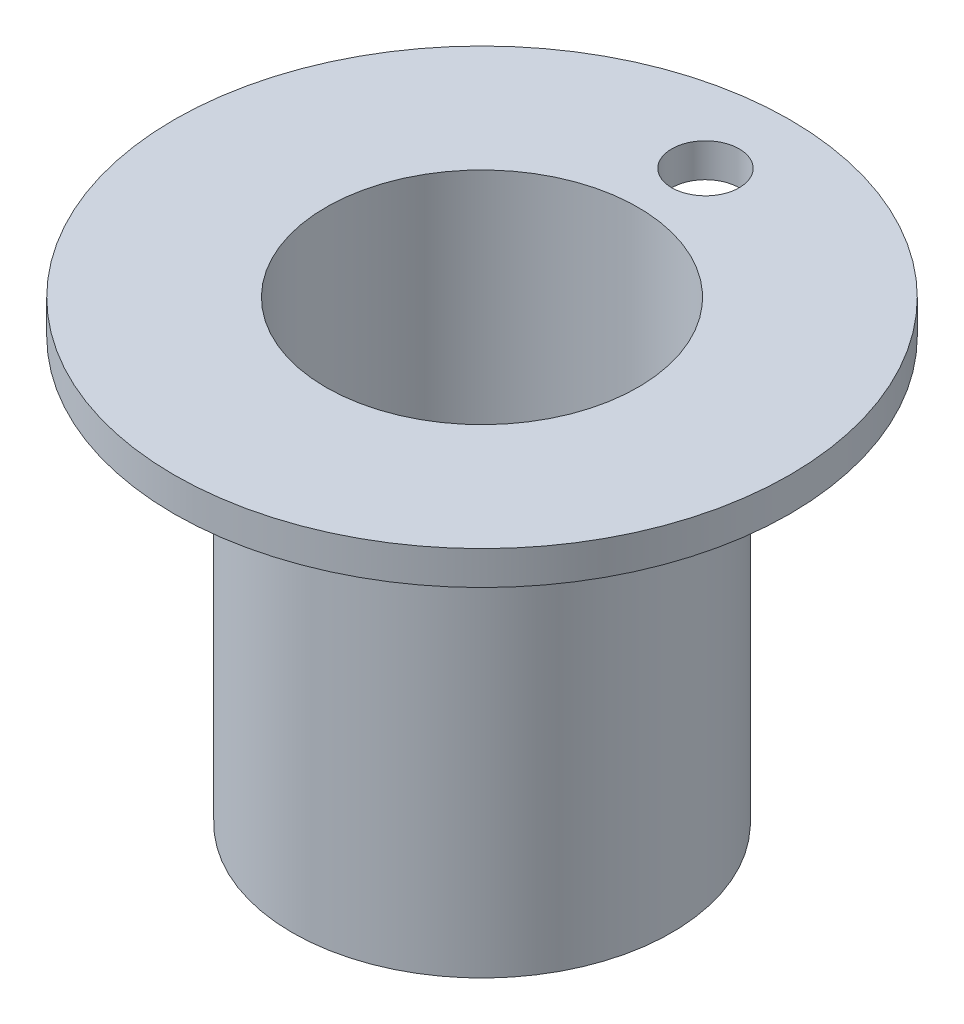
ISO-10303-21;
HEADER;
FILE_DESCRIPTION(('STEP AP214'),'2;1');
FILE_NAME('part.step','',(''),(''),'','','');
FILE_SCHEMA(('AUTOMOTIVE_DESIGN { 1 0 10303 214 1 1 1 1 }'));
ENDSEC;
DATA;
#1=APPLICATION_CONTEXT('core data for automotive mechanical design processes');
#2=APPLICATION_PROTOCOL_DEFINITION('international standard','automotive_design',2000,#1);
#3=PRODUCT_CONTEXT('',#1,'mechanical');
#4=PRODUCT('Part','Part','',(#3));
#5=PRODUCT_RELATED_PRODUCT_CATEGORY('part','',(#4));
#6=PRODUCT_DEFINITION_FORMATION('','',#4);
#7=PRODUCT_DEFINITION_CONTEXT('part definition',#1,'design');
#8=PRODUCT_DEFINITION('design','',#6,#7);
#9=PRODUCT_DEFINITION_SHAPE('','',#8);
#10=(LENGTH_UNIT() NAMED_UNIT(*) SI_UNIT(.MILLI.,.METRE.));
#11=(NAMED_UNIT(*) PLANE_ANGLE_UNIT() SI_UNIT($,.RADIAN.));
#12=(NAMED_UNIT(*) SI_UNIT($,.STERADIAN.) SOLID_ANGLE_UNIT());
#13=UNCERTAINTY_MEASURE_WITH_UNIT(LENGTH_MEASURE(1.E-05),#10,'distance_accuracy_value','');
#14=(GEOMETRIC_REPRESENTATION_CONTEXT(3) GLOBAL_UNCERTAINTY_ASSIGNED_CONTEXT((#13)) GLOBAL_UNIT_ASSIGNED_CONTEXT((#10,
#11,#12)) REPRESENTATION_CONTEXT('',''));
#15=CARTESIAN_POINT('',(0.,0.,0.));
#16=DIRECTION('',(0.,0.,1.));
#17=DIRECTION('',(1.,0.,0.));
#18=AXIS2_PLACEMENT_3D('',#15,#16,#17);
#19=CARTESIAN_POINT('',(0.,0.,0.));
#20=DIRECTION('',(0.,1.,0.));
#21=DIRECTION('',(0.,0.,1.));
#22=AXIS2_PLACEMENT_3D('',#19,#20,#21);
#23=PLANE('',#22);
#24=CARTESIAN_POINT('',(0.,0.,0.));
#25=DIRECTION('',(0.,1.,0.));
#26=DIRECTION('',(0.,0.,1.));
#27=AXIS2_PLACEMENT_3D('',#24,#25,#26);
#28=CIRCLE('',#27,11.25);
#29=CARTESIAN_POINT('',(0.,0.,11.25));
#30=VERTEX_POINT('',#29);
#31=EDGE_CURVE('E47',#30,#30,#28,.T.);
#32=ORIENTED_EDGE('',*,*,#31,.F.);
#33=EDGE_LOOP('',(#32));
#34=FACE_BOUND('',#33,.T.);
#35=CARTESIAN_POINT('',(0.,0.,0.));
#36=DIRECTION('',(0.,1.,0.));
#37=DIRECTION('',(0.,0.,1.));
#38=AXIS2_PLACEMENT_3D('',#35,#36,#37);
#39=CIRCLE('',#38,9.25);
#40=CARTESIAN_POINT('',(0.,0.,9.25));
#41=VERTEX_POINT('',#40);
#42=EDGE_CURVE('E75',#41,#41,#39,.T.);
#43=ORIENTED_EDGE('',*,*,#42,.T.);
#44=EDGE_LOOP('',(#43));
#45=FACE_BOUND('',#44,.T.);
#46=ADVANCED_FACE('F43',(#34,#45),#23,.F.);
#47=CARTESIAN_POINT('',(0.,25.,0.));
#48=DIRECTION('',(0.,-1.,0.));
#49=DIRECTION('',(0.,0.,-1.));
#50=AXIS2_PLACEMENT_3D('',#47,#48,#49);
#51=CYLINDRICAL_SURFACE('',#50,11.25);
#52=CARTESIAN_POINT('',(0.,25.,0.));
#53=DIRECTION('',(0.,1.,0.));
#54=DIRECTION('',(0.,0.,1.));
#55=AXIS2_PLACEMENT_3D('',#52,#53,#54);
#56=CIRCLE('',#55,11.25);
#57=CARTESIAN_POINT('',(0.,25.,-11.25));
#58=VERTEX_POINT('',#57);
#59=EDGE_CURVE('E11',#58,#58,#56,.T.);
#60=ORIENTED_EDGE('',*,*,#59,.F.);
#61=EDGE_LOOP('',(#60));
#62=FACE_BOUND('',#61,.T.);
#63=ORIENTED_EDGE('',*,*,#31,.T.);
#64=EDGE_LOOP('',(#63));
#65=FACE_BOUND('',#64,.T.);
#66=ADVANCED_FACE('F45',(#62,#65),#51,.T.);
#67=CARTESIAN_POINT('',(0.,25.,0.));
#68=DIRECTION('',(0.,-1.,0.));
#69=DIRECTION('',(0.,0.,-1.));
#70=AXIS2_PLACEMENT_3D('',#67,#68,#69);
#71=CYLINDRICAL_SURFACE('',#70,9.25);
#72=ORIENTED_EDGE('',*,*,#42,.F.);
#73=EDGE_LOOP('',(#72));
#74=FACE_BOUND('',#73,.T.);
#75=CARTESIAN_POINT('',(0.,27.,0.));
#76=DIRECTION('',(0.,1.,0.));
#77=DIRECTION('',(0.,0.,1.));
#78=AXIS2_PLACEMENT_3D('',#75,#76,#77);
#79=CIRCLE('',#78,9.25);
#80=CARTESIAN_POINT('',(0.,27.,9.25));
#81=VERTEX_POINT('',#80);
#82=EDGE_CURVE('E60',#81,#81,#79,.T.);
#83=ORIENTED_EDGE('',*,*,#82,.T.);
#84=EDGE_LOOP('',(#83));
#85=FACE_BOUND('',#84,.T.);
#86=ADVANCED_FACE('F92',(#74,#85),#71,.F.);
#87=CARTESIAN_POINT('',(0.,27.,0.));
#88=DIRECTION('',(0.,1.,0.));
#89=DIRECTION('',(0.,0.,1.));
#90=AXIS2_PLACEMENT_3D('',#87,#88,#89);
#91=PLANE('',#90);
#92=CARTESIAN_POINT('',(0.,27.,-13.25));
#93=DIRECTION('',(0.,1.,0.));
#94=DIRECTION('',(0.,0.,1.));
#95=AXIS2_PLACEMENT_3D('',#92,#93,#94);
#96=CIRCLE('',#95,2.);
#97=CARTESIAN_POINT('',(0.,27.,-11.25));
#98=VERTEX_POINT('',#97);
#99=EDGE_CURVE('E61',#98,#98,#96,.T.);
#100=ORIENTED_EDGE('',*,*,#99,.F.);
#101=EDGE_LOOP('',(#100));
#102=FACE_BOUND('',#101,.T.);
#103=CARTESIAN_POINT('',(0.,27.,0.));
#104=DIRECTION('',(0.,1.,0.));
#105=DIRECTION('',(0.,0.,1.));
#106=AXIS2_PLACEMENT_3D('',#103,#104,#105);
#107=CIRCLE('',#106,18.25);
#108=CARTESIAN_POINT('',(0.,27.,18.25));
#109=VERTEX_POINT('',#108);
#110=EDGE_CURVE('E71',#109,#109,#107,.T.);
#111=ORIENTED_EDGE('',*,*,#110,.T.);
#112=EDGE_LOOP('',(#111));
#113=FACE_BOUND('',#112,.T.);
#114=ORIENTED_EDGE('',*,*,#82,.F.);
#115=EDGE_LOOP('',(#114));
#116=FACE_BOUND('',#115,.T.);
#117=ADVANCED_FACE('F97',(#102,#113,#116),#91,.T.);
#118=CARTESIAN_POINT('',(0.,25.,0.));
#119=DIRECTION('',(0.,1.,0.));
#120=DIRECTION('',(0.,0.,1.));
#121=AXIS2_PLACEMENT_3D('',#118,#119,#120);
#122=PLANE('',#121);
#123=ORIENTED_EDGE('',*,*,#59,.T.);
#124=CARTESIAN_POINT('',(0.,25.,-13.25));
#125=DIRECTION('',(0.,1.,0.));
#126=DIRECTION('',(0.,0.,1.));
#127=AXIS2_PLACEMENT_3D('',#124,#125,#126);
#128=CIRCLE('',#127,2.);
#129=EDGE_CURVE('E55',#58,#58,#128,.T.);
#130=ORIENTED_EDGE('',*,*,#129,.T.);
#131=EDGE_LOOP('',(#123,#130));
#132=FACE_BOUND('',#131,.T.);
#133=CARTESIAN_POINT('',(0.,25.,0.));
#134=DIRECTION('',(0.,1.,0.));
#135=DIRECTION('',(0.,0.,1.));
#136=AXIS2_PLACEMENT_3D('',#133,#134,#135);
#137=CIRCLE('',#136,18.25);
#138=CARTESIAN_POINT('',(0.,25.,18.25));
#139=VERTEX_POINT('',#138);
#140=EDGE_CURVE('E66',#139,#139,#137,.T.);
#141=ORIENTED_EDGE('',*,*,#140,.F.);
#142=EDGE_LOOP('',(#141));
#143=FACE_BOUND('',#142,.T.);
#144=ADVANCED_FACE('F102',(#132,#143),#122,.F.);
#145=CARTESIAN_POINT('',(0.,27.,0.));
#146=DIRECTION('',(0.,-1.,0.));
#147=DIRECTION('',(0.,0.,-1.));
#148=AXIS2_PLACEMENT_3D('',#145,#146,#147);
#149=CYLINDRICAL_SURFACE('',#148,18.25);
#150=ORIENTED_EDGE('',*,*,#110,.F.);
#151=EDGE_LOOP('',(#150));
#152=FACE_BOUND('',#151,.T.);
#153=ORIENTED_EDGE('',*,*,#140,.T.);
#154=EDGE_LOOP('',(#153));
#155=FACE_BOUND('',#154,.T.);
#156=ADVANCED_FACE('F99',(#152,#155),#149,.T.);
#157=CARTESIAN_POINT('',(0.,25.,-13.25));
#158=DIRECTION('',(0.,1.,0.));
#159=DIRECTION('',(0.,0.,1.));
#160=AXIS2_PLACEMENT_3D('',#157,#158,#159);
#161=CYLINDRICAL_SURFACE('',#160,2.);
#162=ORIENTED_EDGE('',*,*,#129,.F.);
#163=EDGE_LOOP('',(#162));
#164=FACE_BOUND('',#163,.T.);
#165=ORIENTED_EDGE('',*,*,#99,.T.);
#166=EDGE_LOOP('',(#165));
#167=FACE_BOUND('',#166,.T.);
#168=ADVANCED_FACE('F56',(#164,#167),#161,.F.);
#169=CLOSED_SHELL('',(#46,#66,#86,#117,#144,#156,#168));
#170=MANIFOLD_SOLID_BREP('B2',#169);
#171=ADVANCED_BREP_SHAPE_REPRESENTATION('',(#18,#170),#14);
#172=SHAPE_DEFINITION_REPRESENTATION(#9,#171);
ENDSEC;
END-ISO-10303-21;
